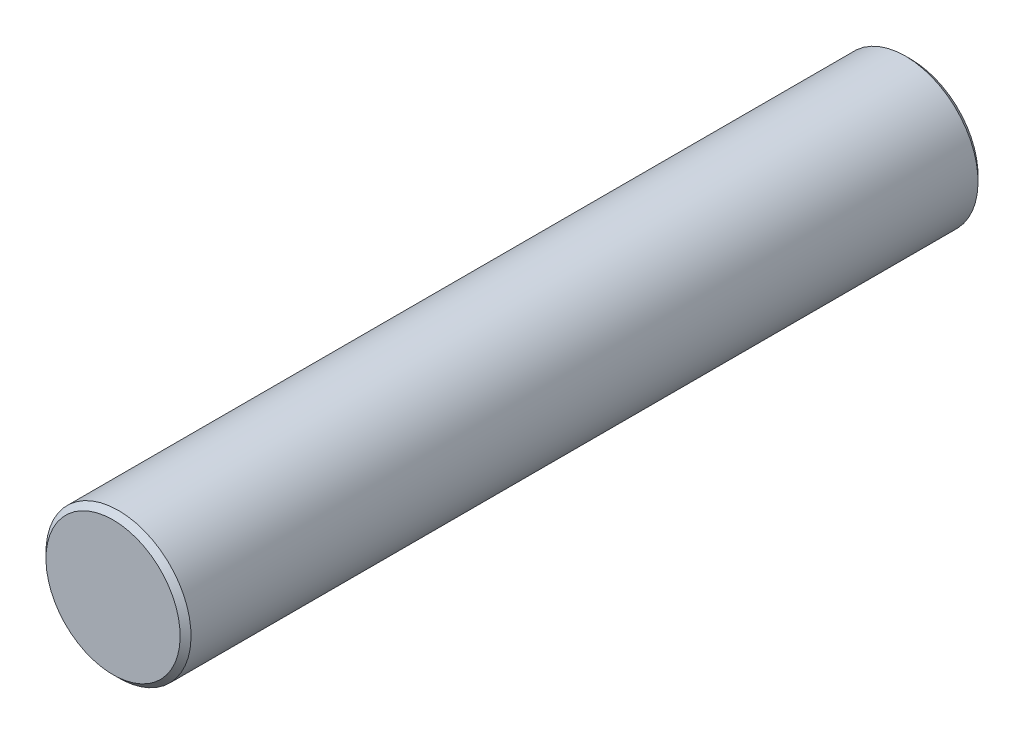
ISO-10303-21;
HEADER;
FILE_DESCRIPTION(('STEP AP214'),'2;1');
FILE_NAME('part.step','',(''),(''),'','','');
FILE_SCHEMA(('AUTOMOTIVE_DESIGN { 1 0 10303 214 1 1 1 1 }'));
ENDSEC;
DATA;
#1=APPLICATION_CONTEXT('core data for automotive mechanical design processes');
#2=APPLICATION_PROTOCOL_DEFINITION('international standard','automotive_design',2000,#1);
#3=PRODUCT_CONTEXT('',#1,'mechanical');
#4=PRODUCT('Part','Part','',(#3));
#5=PRODUCT_RELATED_PRODUCT_CATEGORY('part','',(#4));
#6=PRODUCT_DEFINITION_FORMATION('','',#4);
#7=PRODUCT_DEFINITION_CONTEXT('part definition',#1,'design');
#8=PRODUCT_DEFINITION('design','',#6,#7);
#9=PRODUCT_DEFINITION_SHAPE('','',#8);
#10=(LENGTH_UNIT() NAMED_UNIT(*) SI_UNIT(.MILLI.,.METRE.));
#11=(NAMED_UNIT(*) PLANE_ANGLE_UNIT() SI_UNIT($,.RADIAN.));
#12=(NAMED_UNIT(*) SI_UNIT($,.STERADIAN.) SOLID_ANGLE_UNIT());
#13=UNCERTAINTY_MEASURE_WITH_UNIT(LENGTH_MEASURE(1.E-05),#10,'distance_accuracy_value','');
#14=(GEOMETRIC_REPRESENTATION_CONTEXT(3) GLOBAL_UNCERTAINTY_ASSIGNED_CONTEXT((#13)) GLOBAL_UNIT_ASSIGNED_CONTEXT((#10,
#11,#12)) REPRESENTATION_CONTEXT('',''));
#15=CARTESIAN_POINT('',(0.,0.,0.));
#16=DIRECTION('',(0.,0.,1.));
#17=DIRECTION('',(1.,0.,0.));
#18=AXIS2_PLACEMENT_3D('',#15,#16,#17);
#19=CARTESIAN_POINT('',(0.,9.25,0.));
#20=DIRECTION('',(0.,0.,-1.));
#21=DIRECTION('',(0.,1.,0.));
#22=AXIS2_PLACEMENT_3D('',#19,#20,#21);
#23=PLANE('',#22);
#24=CARTESIAN_POINT('',(0.,0.,0.));
#25=DIRECTION('',(0.,0.,-1.));
#26=DIRECTION('',(0.,1.,0.));
#27=AXIS2_PLACEMENT_3D('',#24,#25,#26);
#28=CIRCLE('',#27,18.5);
#29=CARTESIAN_POINT('',(0.,18.5,0.));
#30=VERTEX_POINT('',#29);
#31=EDGE_CURVE('E9',#30,#30,#28,.T.);
#32=ORIENTED_EDGE('',*,*,#31,.T.);
#33=EDGE_LOOP('',(#32));
#34=FACE_BOUND('',#33,.T.);
#35=CARTESIAN_POINT('',(0.,0.,0.));
#36=DIRECTION('',(0.,0.,1.));
#37=DIRECTION('',(-1.,0.,0.));
#38=AXIS2_PLACEMENT_3D('',#35,#36,#37);
#39=CIRCLE('',#38,6.);
#40=CARTESIAN_POINT('',(-6.,0.,0.));
#41=VERTEX_POINT('',#40);
#42=EDGE_CURVE('E52',#41,#41,#39,.T.);
#43=ORIENTED_EDGE('',*,*,#42,.T.);
#44=EDGE_LOOP('',(#43));
#45=FACE_BOUND('',#44,.T.);
#46=ADVANCED_FACE('F15',(#34,#45),#23,.T.);
#47=CARTESIAN_POINT('',(0.,0.,0.75));
#48=DIRECTION('',(0.,0.,1.));
#49=DIRECTION('',(0.,1.,0.));
#50=AXIS2_PLACEMENT_3D('',#47,#48,#49);
#51=CONICAL_SURFACE('',#50,19.25,0.785398163397448);
#52=CARTESIAN_POINT('',(0.,0.,1.5));
#53=DIRECTION('',(0.,0.,-1.));
#54=DIRECTION('',(0.,1.,0.));
#55=AXIS2_PLACEMENT_3D('',#52,#53,#54);
#56=CIRCLE('',#55,20.);
#57=CARTESIAN_POINT('',(0.,20.,1.5));
#58=VERTEX_POINT('',#57);
#59=EDGE_CURVE('E25',#58,#58,#56,.T.);
#60=ORIENTED_EDGE('',*,*,#59,.T.);
#61=EDGE_LOOP('',(#60));
#62=FACE_BOUND('',#61,.T.);
#63=ORIENTED_EDGE('',*,*,#31,.F.);
#64=EDGE_LOOP('',(#63));
#65=FACE_BOUND('',#64,.T.);
#66=ADVANCED_FACE('F121',(#62,#65),#51,.T.);
#67=CARTESIAN_POINT('',(0.,0.,110.));
#68=DIRECTION('',(0.,0.,1.));
#69=DIRECTION('',(0.,1.,0.));
#70=AXIS2_PLACEMENT_3D('',#67,#68,#69);
#71=CYLINDRICAL_SURFACE('',#70,20.);
#72=CARTESIAN_POINT('',(0.,0.,218.5));
#73=DIRECTION('',(0.,0.,-1.));
#74=DIRECTION('',(0.,1.,0.));
#75=AXIS2_PLACEMENT_3D('',#72,#73,#74);
#76=CIRCLE('',#75,20.);
#77=CARTESIAN_POINT('',(0.,20.,218.5));
#78=VERTEX_POINT('',#77);
#79=EDGE_CURVE('E19',#78,#78,#76,.T.);
#80=ORIENTED_EDGE('',*,*,#79,.T.);
#81=EDGE_LOOP('',(#80));
#82=FACE_BOUND('',#81,.T.);
#83=ORIENTED_EDGE('',*,*,#59,.F.);
#84=EDGE_LOOP('',(#83));
#85=FACE_BOUND('',#84,.T.);
#86=CARTESIAN_POINT('',(0.,0.,6.5));
#87=DIRECTION('',(0.,0.,-1.));
#88=DIRECTION('',(0.,1.,0.));
#89=AXIS2_PLACEMENT_3D('',#86,#87,#88);
#90=CIRCLE('',#89,20.);
#91=CARTESIAN_POINT('',(10.5356537528527,-17.,6.5));
#92=VERTEX_POINT('',#91);
#93=CARTESIAN_POINT('',(-10.5356537528527,-17.,6.5));
#94=VERTEX_POINT('',#93);
#95=EDGE_CURVE('E69',#92,#94,#90,.T.);
#96=ORIENTED_EDGE('',*,*,#95,.T.);
#97=DIRECTION('',(0.,0.,1.));
#98=VECTOR('',#97,1.);
#99=CARTESIAN_POINT('',(-10.5356537528527,-17.,8.25));
#100=LINE('',#99,#98);
#101=CARTESIAN_POINT('',(-10.5356537528527,-17.,10.));
#102=VERTEX_POINT('',#101);
#103=EDGE_CURVE('E62',#94,#102,#100,.T.);
#104=ORIENTED_EDGE('',*,*,#103,.T.);
#105=CARTESIAN_POINT('',(0.,0.,10.));
#106=DIRECTION('',(0.,0.,1.));
#107=DIRECTION('',(0.,1.,0.));
#108=AXIS2_PLACEMENT_3D('',#105,#106,#107);
#109=CIRCLE('',#108,20.);
#110=CARTESIAN_POINT('',(10.5356537528527,-17.,10.));
#111=VERTEX_POINT('',#110);
#112=EDGE_CURVE('E75',#102,#111,#109,.T.);
#113=ORIENTED_EDGE('',*,*,#112,.T.);
#114=DIRECTION('',(0.,0.,-1.));
#115=VECTOR('',#114,1.);
#116=CARTESIAN_POINT('',(10.5356537528527,-17.,8.25));
#117=LINE('',#116,#115);
#118=EDGE_CURVE('E60',#111,#92,#117,.T.);
#119=ORIENTED_EDGE('',*,*,#118,.T.);
#120=EDGE_LOOP('',(#96,#104,#113,#119));
#121=FACE_BOUND('',#120,.T.);
#122=ADVANCED_FACE('F17',(#82,#85,#121),#71,.T.);
#123=CARTESIAN_POINT('',(0.,0.,219.25));
#124=DIRECTION('',(0.,0.,-1.));
#125=DIRECTION('',(0.,1.,0.));
#126=AXIS2_PLACEMENT_3D('',#123,#124,#125);
#127=CONICAL_SURFACE('',#126,19.25,0.785398163397448);
#128=CARTESIAN_POINT('',(0.,0.,220.));
#129=DIRECTION('',(0.,0.,-1.));
#130=DIRECTION('',(0.,1.,0.));
#131=AXIS2_PLACEMENT_3D('',#128,#129,#130);
#132=CIRCLE('',#131,18.5);
#133=CARTESIAN_POINT('',(0.,18.5,220.));
#134=VERTEX_POINT('',#133);
#135=EDGE_CURVE('E44',#134,#134,#132,.T.);
#136=ORIENTED_EDGE('',*,*,#135,.T.);
#137=EDGE_LOOP('',(#136));
#138=FACE_BOUND('',#137,.T.);
#139=ORIENTED_EDGE('',*,*,#79,.F.);
#140=EDGE_LOOP('',(#139));
#141=FACE_BOUND('',#140,.T.);
#142=ADVANCED_FACE('F116',(#138,#141),#127,.T.);
#143=CARTESIAN_POINT('',(0.,9.25,220.));
#144=DIRECTION('',(0.,0.,1.));
#145=DIRECTION('',(0.,-1.,0.));
#146=AXIS2_PLACEMENT_3D('',#143,#144,#145);
#147=PLANE('',#146);
#148=ORIENTED_EDGE('',*,*,#135,.F.);
#149=EDGE_LOOP('',(#148));
#150=FACE_BOUND('',#149,.T.);
#151=ADVANCED_FACE('F110',(#150),#147,.T.);
#152=CARTESIAN_POINT('',(0.,0.,26.4586213285198));
#153=DIRECTION('',(0.,0.,-1.));
#154=DIRECTION('',(-1.,0.,0.));
#155=AXIS2_PLACEMENT_3D('',#152,#153,#154);
#156=CONICAL_SURFACE('',#155,2.52640625,1.0471975511966);
#157=CARTESIAN_POINT('',(0.,0.,25.));
#158=DIRECTION('',(0.,0.,1.));
#159=DIRECTION('',(-1.,0.,0.));
#160=AXIS2_PLACEMENT_3D('',#157,#158,#159);
#161=CIRCLE('',#160,5.0528125);
#162=CARTESIAN_POINT('',(-5.0528125,0.,25.));
#163=VERTEX_POINT('',#162);
#164=EDGE_CURVE('E51',#163,#163,#161,.T.);
#165=ORIENTED_EDGE('',*,*,#164,.F.);
#166=EDGE_LOOP('',(#165));
#167=FACE_BOUND('',#166,.T.);
#168=CARTESIAN_POINT('',(0.,0.,27.9172426570397));
#169=VERTEX_POINT('',#168);
#170=VERTEX_LOOP('',#169);
#171=FACE_BOUND('',#170,.T.);
#172=ADVANCED_FACE('F104',(#167,#171),#156,.F.);
#173=CARTESIAN_POINT('',(0.,0.,12.97359375));
#174=DIRECTION('',(0.,0.,-1.));
#175=DIRECTION('',(-1.,0.,0.));
#176=AXIS2_PLACEMENT_3D('',#173,#174,#175);
#177=CYLINDRICAL_SURFACE('',#176,5.0528125);
#178=CARTESIAN_POINT('',(0.,0.,0.9471875));
#179=DIRECTION('',(0.,0.,1.));
#180=DIRECTION('',(-1.,0.,0.));
#181=AXIS2_PLACEMENT_3D('',#178,#179,#180);
#182=CIRCLE('',#181,5.0528125);
#183=CARTESIAN_POINT('',(-5.0528125,0.,0.9471875));
#184=VERTEX_POINT('',#183);
#185=EDGE_CURVE('E57',#184,#184,#182,.T.);
#186=ORIENTED_EDGE('',*,*,#185,.F.);
#187=EDGE_LOOP('',(#186));
#188=FACE_BOUND('',#187,.T.);
#189=ORIENTED_EDGE('',*,*,#164,.T.);
#190=EDGE_LOOP('',(#189));
#191=FACE_BOUND('',#190,.T.);
#192=ADVANCED_FACE('F101',(#188,#191),#177,.F.);
#193=CARTESIAN_POINT('',(0.,0.,0.47359375));
#194=DIRECTION('',(0.,0.,-1.));
#195=DIRECTION('',(-1.,0.,0.));
#196=AXIS2_PLACEMENT_3D('',#193,#194,#195);
#197=CONICAL_SURFACE('',#196,5.52640625,0.785398163397448);
#198=ORIENTED_EDGE('',*,*,#42,.F.);
#199=EDGE_LOOP('',(#198));
#200=FACE_BOUND('',#199,.T.);
#201=ORIENTED_EDGE('',*,*,#185,.T.);
#202=EDGE_LOOP('',(#201));
#203=FACE_BOUND('',#202,.T.);
#204=ADVANCED_FACE('F99',(#200,#203),#197,.F.);
#205=CARTESIAN_POINT('',(0.,-17.,8.25));
#206=DIRECTION('',(0.,-1.,0.));
#207=DIRECTION('',(0.,0.,-1.));
#208=AXIS2_PLACEMENT_3D('',#205,#206,#207);
#209=PLANE('',#208);
#210=ORIENTED_EDGE('',*,*,#103,.F.);
#211=DIRECTION('',(1.,0.,0.));
#212=VECTOR('',#211,1.);
#213=CARTESIAN_POINT('',(0.,-17.,6.5));
#214=LINE('',#213,#212);
#215=EDGE_CURVE('E66',#94,#92,#214,.T.);
#216=ORIENTED_EDGE('',*,*,#215,.T.);
#217=ORIENTED_EDGE('',*,*,#118,.F.);
#218=DIRECTION('',(-1.,0.,0.));
#219=VECTOR('',#218,1.);
#220=CARTESIAN_POINT('',(0.,-17.,10.));
#221=LINE('',#220,#219);
#222=EDGE_CURVE('E72',#111,#102,#221,.T.);
#223=ORIENTED_EDGE('',*,*,#222,.T.);
#224=EDGE_LOOP('',(#210,#216,#217,#223));
#225=FACE_BOUND('',#224,.T.);
#226=ADVANCED_FACE('F131',(#225),#209,.T.);
#227=CARTESIAN_POINT('',(0.,-19.5,6.5));
#228=DIRECTION('',(0.,0.,1.));
#229=DIRECTION('',(1.,0.,0.));
#230=AXIS2_PLACEMENT_3D('',#227,#228,#229);
#231=PLANE('',#230);
#232=ORIENTED_EDGE('',*,*,#95,.F.);
#233=ORIENTED_EDGE('',*,*,#215,.F.);
#234=EDGE_LOOP('',(#232,#233));
#235=FACE_BOUND('',#234,.T.);
#236=ADVANCED_FACE('F135',(#235),#231,.T.);
#237=CARTESIAN_POINT('',(0.,-19.5,10.));
#238=DIRECTION('',(0.,0.,1.));
#239=DIRECTION('',(1.,0.,0.));
#240=AXIS2_PLACEMENT_3D('',#237,#238,#239);
#241=PLANE('',#240);
#242=ORIENTED_EDGE('',*,*,#112,.F.);
#243=ORIENTED_EDGE('',*,*,#222,.F.);
#244=EDGE_LOOP('',(#242,#243));
#245=FACE_BOUND('',#244,.T.);
#246=ADVANCED_FACE('F87',(#245),#241,.F.);
#247=CLOSED_SHELL('',(#46,#66,#122,#142,#151,#172,#192,#204,#226,#236,#246));
#248=MANIFOLD_SOLID_BREP('B1',#247);
#249=ADVANCED_BREP_SHAPE_REPRESENTATION('',(#18,#248),#14);
#250=SHAPE_DEFINITION_REPRESENTATION(#9,#249);
ENDSEC;
END-ISO-10303-21;
